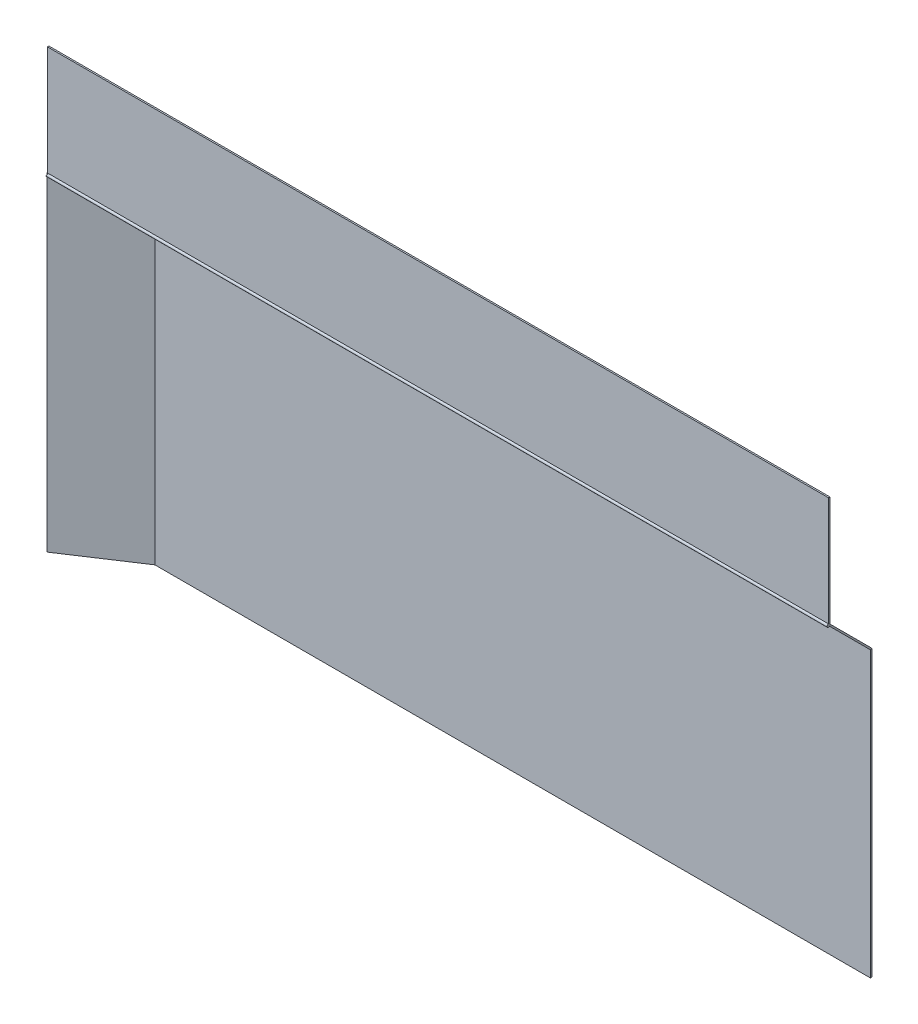
ISO-10303-21;
HEADER;
FILE_DESCRIPTION(('STEP AP214'),'2;1');
FILE_NAME('part.step','',(''),(''),'','','');
FILE_SCHEMA(('AUTOMOTIVE_DESIGN { 1 0 10303 214 1 1 1 1 }'));
ENDSEC;
DATA;
#1=APPLICATION_CONTEXT('core data for automotive mechanical design processes');
#2=APPLICATION_PROTOCOL_DEFINITION('international standard','automotive_design',2000,#1);
#3=PRODUCT_CONTEXT('',#1,'mechanical');
#4=PRODUCT('Part','Part','',(#3));
#5=PRODUCT_RELATED_PRODUCT_CATEGORY('part','',(#4));
#6=PRODUCT_DEFINITION_FORMATION('','',#4);
#7=PRODUCT_DEFINITION_CONTEXT('part definition',#1,'design');
#8=PRODUCT_DEFINITION('design','',#6,#7);
#9=PRODUCT_DEFINITION_SHAPE('','',#8);
#10=(LENGTH_UNIT() NAMED_UNIT(*) SI_UNIT(.MILLI.,.METRE.));
#11=(NAMED_UNIT(*) PLANE_ANGLE_UNIT() SI_UNIT($,.RADIAN.));
#12=(NAMED_UNIT(*) SI_UNIT($,.STERADIAN.) SOLID_ANGLE_UNIT());
#13=UNCERTAINTY_MEASURE_WITH_UNIT(LENGTH_MEASURE(1.E-05),#10,'distance_accuracy_value','');
#14=(GEOMETRIC_REPRESENTATION_CONTEXT(3) GLOBAL_UNCERTAINTY_ASSIGNED_CONTEXT((#13)) GLOBAL_UNIT_ASSIGNED_CONTEXT((#10,
#11,#12)) REPRESENTATION_CONTEXT('',''));
#15=CARTESIAN_POINT('',(0.,0.,0.));
#16=DIRECTION('',(0.,0.,1.));
#17=DIRECTION('',(1.,0.,0.));
#18=AXIS2_PLACEMENT_3D('',#15,#16,#17);
#19=CARTESIAN_POINT('',(-5357.30681818182,469.432628788306,0.565418518433503));
#20=DIRECTION('',(-0.683121837231757,-0.516403212372426,-0.516403212372414));
#21=DIRECTION('',(0.73030442659011,-0.483040083483194,-0.483040083483182));
#22=AXIS2_PLACEMENT_3D('',#19,#20,#21);
#23=PLANE('',#22);
#24=DIRECTION('',(0.73030442659011,-0.483040083483194,-0.483040083483182));
#25=VECTOR('',#24,1.);
#26=CARTESIAN_POINT('',(-5357.30681818182,463.775774538813,6.22227276792597));
#27=LINE('',#26,#25);
#28=CARTESIAN_POINT('',(-5347.89985673074,457.553794664106,0.000292893218845069));
#29=VERTEX_POINT('',#28);
#30=CARTESIAN_POINT('',(-5008.60986244772,233.139617238522,-224.41388453236));
#31=VERTEX_POINT('',#30);
#32=EDGE_CURVE('E87',#29,#31,#27,.T.);
#33=ORIENTED_EDGE('',*,*,#32,.F.);
#34=CARTESIAN_POINT('',(-5347.89985673074,463.210648913598,-5.6565613562737));
#35=CARTESIAN_POINT('',(-5347.89985673074,457.553794664106,0.000292893218812977));
#36=CARTESIAN_POINT('',(-5347.89985673074,457.497226121611,0.0568614357137381));
#37=B_SPLINE_CURVE_WITH_KNOTS('',1,(#34,#35,#36),.UNSPECIFIED.,.F.,.F.,(2,1,2),(0.,1.,1.01),.UNSPECIFIED.);
#38=CARTESIAN_POINT('',(-5347.89985673074,463.210648913598,-5.6565613562737));
#39=VERTEX_POINT('',#38);
#40=EDGE_CURVE('E181',#29,#39,#37,.F.);
#41=ORIENTED_EDGE('',*,*,#40,.T.);
#42=DIRECTION('',(0.73030442659011,-0.483040083483194,-0.483040083483182));
#43=VECTOR('',#42,1.);
#44=CARTESIAN_POINT('',(-5357.30681818182,469.432628788306,0.565418518433503));
#45=LINE('',#44,#43);
#46=CARTESIAN_POINT('',(-5008.60986244772,238.796471488014,-230.070738781852));
#47=VERTEX_POINT('',#46);
#48=EDGE_CURVE('E183',#39,#47,#45,.T.);
#49=ORIENTED_EDGE('',*,*,#48,.T.);
#50=DIRECTION('',(0.,-0.707106781186539,0.707106781186556));
#51=VECTOR('',#50,1.);
#52=CARTESIAN_POINT('',(-5008.60986244772,238.796471488014,-230.070738781852));
#53=LINE('',#52,#51);
#54=EDGE_CURVE('E198',#47,#31,#53,.T.);
#55=ORIENTED_EDGE('',*,*,#54,.T.);
#56=EDGE_LOOP('',(#33,#41,#49,#55));
#57=FACE_BOUND('',#56,.T.);
#58=ADVANCED_FACE('F61',(#57),#23,.T.);
#59=CARTESIAN_POINT('',(-5001.30681818182,228.30921640369,-229.244285367192));
#60=DIRECTION('',(0.,-0.707106781186539,0.707106781186556));
#61=DIRECTION('',(1.,0.,0.));
#62=AXIS2_PLACEMENT_3D('',#59,#60,#61);
#63=PLANE('',#62);
#64=DIRECTION('',(0.,0.707106781186556,0.707106781186539));
#65=VECTOR('',#64,1.);
#66=CARTESIAN_POINT('',(-1101.30681818182,896.525124624986,438.971622854088));
#67=LINE('',#66,#65);
#68=CARTESIAN_POINT('',(-1101.30681818182,229.197792991322,-228.35570877956));
#69=VERTEX_POINT('',#68);
#70=CARTESIAN_POINT('',(-1101.30681818182,457.55326433402,7.32233047033051E-05));
#71=VERTEX_POINT('',#70);
#72=EDGE_CURVE('E80',#69,#71,#67,.T.);
#73=ORIENTED_EDGE('',*,*,#72,.T.);
#74=CARTESIAN_POINT('',(-1101.30681818182,457.553794664106,0.000292893218789558));
#75=DIRECTION('',(-1.,0.,0.));
#76=VECTOR('',#75,1.);
#77=LINE('',#74,#76);
#78=EDGE_CURVE('E72',#71,#29,#77,.T.);
#79=ORIENTED_EDGE('',*,*,#78,.T.);
#80=ORIENTED_EDGE('',*,*,#32,.T.);
#81=CARTESIAN_POINT('',(-5001.30681818182,228.30921640369,-229.244285367192));
#82=DIRECTION('',(0.,0.707106781186539,-0.707106781186556));
#83=DIRECTION('',(1.,0.,0.));
#84=AXIS2_PLACEMENT_3D('',#81,#82,#83);
#85=CIRCLE('',#84,9.99999999999958);
#86=CARTESIAN_POINT('',(-4991.38608921184,229.197792991322,-228.35570877956));
#87=VERTEX_POINT('',#86);
#88=EDGE_CURVE('E428',#31,#87,#85,.T.);
#89=ORIENTED_EDGE('',*,*,#88,.T.);
#90=DIRECTION('',(-1.,0.,0.));
#91=VECTOR('',#90,1.);
#92=CARTESIAN_POINT('',(-5001.30681818182,229.197792991322,-228.35570877956));
#93=LINE('',#92,#91);
#94=EDGE_CURVE('E422',#69,#87,#93,.T.);
#95=ORIENTED_EDGE('',*,*,#94,.F.);
#96=EDGE_LOOP('',(#73,#79,#80,#89,#95));
#97=FACE_BOUND('',#96,.T.);
#98=ADVANCED_FACE('F487',(#97),#63,.T.);
#99=CARTESIAN_POINT('',(-1101.30681818182,902.181978874478,433.314768604595));
#100=DIRECTION('',(1.,0.,0.));
#101=DIRECTION('',(0.,0.707106781186556,0.707106781186539));
#102=AXIS2_PLACEMENT_3D('',#99,#100,#101);
#103=PLANE('',#102);
#104=DIRECTION('',(0.,0.707106781186556,0.707106781186539));
#105=VECTOR('',#104,1.);
#106=CARTESIAN_POINT('',(-1101.30681818182,469.432628788306,0.565418518433503));
#107=LINE('',#106,#105);
#108=CARTESIAN_POINT('',(-1101.30681818182,234.854647240814,-234.012563029052));
#109=VERTEX_POINT('',#108);
#110=CARTESIAN_POINT('',(-1101.30681818182,463.210648913598,-5.65656135627363));
#111=VERTEX_POINT('',#110);
#112=EDGE_CURVE('E427',#109,#111,#107,.T.);
#113=ORIENTED_EDGE('',*,*,#112,.T.);
#114=DIRECTION('',(0.,-0.707106781186544,0.707106781186551));
#115=VECTOR('',#114,1.);
#116=CARTESIAN_POINT('',(-1101.30681818182,463.210648913601,-5.65656135627662));
#117=LINE('',#116,#115);
#118=EDGE_CURVE('E12',#111,#71,#117,.T.);
#119=ORIENTED_EDGE('',*,*,#118,.T.);
#120=ORIENTED_EDGE('',*,*,#72,.F.);
#121=DIRECTION('',(0.,-0.707106781186544,0.707106781186551));
#122=VECTOR('',#121,1.);
#123=CARTESIAN_POINT('',(-1101.30681818182,234.854647240819,-234.012563029057));
#124=LINE('',#123,#122);
#125=EDGE_CURVE('E199',#109,#69,#124,.T.);
#126=ORIENTED_EDGE('',*,*,#125,.F.);
#127=EDGE_LOOP('',(#113,#119,#120,#126));
#128=FACE_BOUND('',#127,.T.);
#129=ADVANCED_FACE('F63',(#128),#103,.T.);
#130=CARTESIAN_POINT('',(-5001.30681818182,230.454430052758,-236.35570877956));
#131=DIRECTION('',(0.,0.,1.));
#132=DIRECTION('',(1.,0.,0.));
#133=AXIS2_PLACEMENT_3D('',#130,#131,#132);
#134=PLANE('',#133);
#135=DIRECTION('',(1.,0.,0.));
#136=VECTOR('',#135,1.);
#137=CARTESIAN_POINT('',(-5427.30681818182,-1319.54556994724,-236.355708779538));
#138=LINE('',#137,#136);
#139=CARTESIAN_POINT('',(-5000.37411422955,-1319.54556994724,-236.355708779538));
#140=VERTEX_POINT('',#139);
#141=CARTESIAN_POINT('',(-1101.30681818182,-1319.54556994724,-236.355708779538));
#142=VERTEX_POINT('',#141);
#143=EDGE_CURVE('E454',#140,#142,#138,.T.);
#144=ORIENTED_EDGE('',*,*,#143,.F.);
#145=DIRECTION('',(0.,1.,0.));
#146=VECTOR('',#145,1.);
#147=CARTESIAN_POINT('',(-5000.37411422955,230.454430052758,-236.35570877956));
#148=LINE('',#147,#146);
#149=CARTESIAN_POINT('',(-5000.37411422955,220.498021898337,-236.35570877956));
#150=VERTEX_POINT('',#149);
#151=EDGE_CURVE('E464',#140,#150,#148,.T.);
#152=ORIENTED_EDGE('',*,*,#151,.T.);
#153=CARTESIAN_POINT('',(-5001.30681818182,230.454430052758,-236.35570877956));
#154=DIRECTION('',(0.,0.,-1.));
#155=DIRECTION('',(1.,0.,0.));
#156=AXIS2_PLACEMENT_3D('',#153,#154,#155);
#157=CIRCLE('',#156,9.99999999999958);
#158=CARTESIAN_POINT('',(-4991.38608921184,229.197792991322,-236.35570877956));
#159=VERTEX_POINT('',#158);
#160=EDGE_CURVE('E442',#159,#150,#157,.T.);
#161=ORIENTED_EDGE('',*,*,#160,.F.);
#162=DIRECTION('',(-1.,0.,0.));
#163=VECTOR('',#162,1.);
#164=CARTESIAN_POINT('',(-5001.30681818182,229.197792991322,-236.35570877956));
#165=LINE('',#164,#163);
#166=CARTESIAN_POINT('',(-1101.30681818182,229.197792991322,-236.35570877956));
#167=VERTEX_POINT('',#166);
#168=EDGE_CURVE('E445',#167,#159,#165,.T.);
#169=ORIENTED_EDGE('',*,*,#168,.F.);
#170=DIRECTION('',(0.,1.,0.));
#171=VECTOR('',#170,1.);
#172=CARTESIAN_POINT('',(-1101.30681818182,563.454430052758,-236.355708779564));
#173=LINE('',#172,#171);
#174=EDGE_CURVE('E451',#142,#167,#173,.T.);
#175=ORIENTED_EDGE('',*,*,#174,.F.);
#176=EDGE_LOOP('',(#144,#152,#161,#169,#175));
#177=FACE_BOUND('',#176,.T.);
#178=ADVANCED_FACE('F506',(#177),#134,.F.);
#179=CARTESIAN_POINT('',(-5001.30681818182,230.454430052758,-236.35570877956));
#180=DIRECTION('',(0.,0.,1.));
#181=DIRECTION('',(1.,0.,0.));
#182=AXIS2_PLACEMENT_3D('',#179,#180,#181);
#183=CYLINDRICAL_SURFACE('',#182,9.99999999999958);
#184=DIRECTION('',(0.,0.,-1.));
#185=VECTOR('',#184,1.);
#186=CARTESIAN_POINT('',(-5000.37411422955,220.498021898337,-236.35570877956));
#187=LINE('',#186,#185);
#188=CARTESIAN_POINT('',(-5000.37411422955,220.498021898337,-228.35570877956));
#189=VERTEX_POINT('',#188);
#190=EDGE_CURVE('E461',#189,#150,#187,.T.);
#191=ORIENTED_EDGE('',*,*,#190,.F.);
#192=CARTESIAN_POINT('',(-5001.30681818182,230.454430052758,-228.35570877956));
#193=DIRECTION('',(0.,0.,-1.));
#194=DIRECTION('',(1.,0.,0.));
#195=AXIS2_PLACEMENT_3D('',#192,#193,#194);
#196=CIRCLE('',#195,9.99999999999958);
#197=EDGE_CURVE('E458',#87,#189,#196,.T.);
#198=ORIENTED_EDGE('',*,*,#197,.F.);
#199=DIRECTION('',(0.,0.,-1.));
#200=VECTOR('',#199,1.);
#201=CARTESIAN_POINT('',(-4991.38608921184,229.197792991322,-236.35570877956));
#202=LINE('',#201,#200);
#203=EDGE_CURVE('E447',#87,#159,#202,.T.);
#204=ORIENTED_EDGE('',*,*,#203,.T.);
#205=ORIENTED_EDGE('',*,*,#160,.T.);
#206=EDGE_LOOP('',(#191,#198,#204,#205));
#207=FACE_BOUND('',#206,.T.);
#208=ADVANCED_FACE('F509',(#207),#183,.F.);
#209=CARTESIAN_POINT('',(-1101.30681818182,1175.45443005276,-236.355708779573));
#210=DIRECTION('',(1.,0.,0.));
#211=DIRECTION('',(0.,1.,0.));
#212=AXIS2_PLACEMENT_3D('',#209,#210,#211);
#213=PLANE('',#212);
#214=ORIENTED_EDGE('',*,*,#174,.T.);
#215=DIRECTION('',(0.,0.,1.));
#216=VECTOR('',#215,1.);
#217=CARTESIAN_POINT('',(-1101.30681818182,229.197792991322,-236.355708779566));
#218=LINE('',#217,#216);
#219=EDGE_CURVE('E441',#167,#69,#218,.T.);
#220=ORIENTED_EDGE('',*,*,#219,.T.);
#221=DIRECTION('',(0.,1.,0.));
#222=VECTOR('',#221,1.);
#223=CARTESIAN_POINT('',(-1101.30681818182,1175.45443005276,-228.355708779573));
#224=LINE('',#223,#222);
#225=CARTESIAN_POINT('',(-1101.30681818182,-1319.54556994724,-228.355708779538));
#226=VERTEX_POINT('',#225);
#227=EDGE_CURVE('E455',#226,#69,#224,.T.);
#228=ORIENTED_EDGE('',*,*,#227,.F.);
#229=DIRECTION('',(0.,0.,1.));
#230=VECTOR('',#229,1.);
#231=CARTESIAN_POINT('',(-1101.30681818182,-1319.54556994724,-236.355708779538));
#232=LINE('',#231,#230);
#233=EDGE_CURVE('E438',#142,#226,#232,.T.);
#234=ORIENTED_EDGE('',*,*,#233,.F.);
#235=EDGE_LOOP('',(#214,#220,#228,#234));
#236=FACE_BOUND('',#235,.T.);
#237=ADVANCED_FACE('F513',(#236),#213,.T.);
#238=CARTESIAN_POINT('',(-5001.30681818182,230.454430052758,-228.35570877956));
#239=DIRECTION('',(0.,0.,1.));
#240=DIRECTION('',(1.,0.,0.));
#241=AXIS2_PLACEMENT_3D('',#238,#239,#240);
#242=PLANE('',#241);
#243=DIRECTION('',(0.,1.,0.));
#244=VECTOR('',#243,1.);
#245=CARTESIAN_POINT('',(-5000.37411422955,230.454430052758,-228.35570877956));
#246=LINE('',#245,#244);
#247=CARTESIAN_POINT('',(-5000.37411422955,-1319.54556994724,-228.355708779539));
#248=VERTEX_POINT('',#247);
#249=EDGE_CURVE('E450',#248,#189,#246,.T.);
#250=ORIENTED_EDGE('',*,*,#249,.F.);
#251=DIRECTION('',(1.,0.,0.));
#252=VECTOR('',#251,1.);
#253=CARTESIAN_POINT('',(-5427.30681818182,-1319.54556994724,-228.355708779538));
#254=LINE('',#253,#252);
#255=EDGE_CURVE('E424',#248,#226,#254,.T.);
#256=ORIENTED_EDGE('',*,*,#255,.T.);
#257=ORIENTED_EDGE('',*,*,#227,.T.);
#258=ORIENTED_EDGE('',*,*,#94,.T.);
#259=ORIENTED_EDGE('',*,*,#197,.T.);
#260=EDGE_LOOP('',(#250,#256,#257,#258,#259));
#261=FACE_BOUND('',#260,.T.);
#262=ADVANCED_FACE('F504',(#261),#242,.T.);
#263=CARTESIAN_POINT('',(-5427.30681818182,-1319.54556994724,-236.355708779538));
#264=DIRECTION('',(0.,-1.,0.));
#265=DIRECTION('',(0.,0.,-1.));
#266=AXIS2_PLACEMENT_3D('',#263,#264,#265);
#267=PLANE('',#266);
#268=DIRECTION('',(0.,0.,1.));
#269=VECTOR('',#268,1.);
#270=CARTESIAN_POINT('',(-5000.37411422955,-1319.54556994724,-236.355708779538));
#271=LINE('',#270,#269);
#272=EDGE_CURVE('E212',#140,#248,#271,.T.);
#273=ORIENTED_EDGE('',*,*,#272,.F.);
#274=ORIENTED_EDGE('',*,*,#143,.T.);
#275=ORIENTED_EDGE('',*,*,#233,.T.);
#276=ORIENTED_EDGE('',*,*,#255,.F.);
#277=EDGE_LOOP('',(#273,#274,#275,#276));
#278=FACE_BOUND('',#277,.T.);
#279=ADVANCED_FACE('F501',(#278),#267,.T.);
#280=CARTESIAN_POINT('',(-5001.30681818182,233.966070653182,-234.901139616684));
#281=DIRECTION('',(0.,-0.707106781186539,0.707106781186556));
#282=DIRECTION('',(1.,0.,0.));
#283=AXIS2_PLACEMENT_3D('',#280,#281,#282);
#284=PLANE('',#283);
#285=DIRECTION('',(-1.,0.,0.));
#286=VECTOR('',#285,1.);
#287=CARTESIAN_POINT('',(-5001.30681818182,463.210648913598,-5.65656135627363));
#288=LINE('',#287,#286);
#289=EDGE_CURVE('E189',#111,#39,#288,.T.);
#290=ORIENTED_EDGE('',*,*,#289,.F.);
#291=ORIENTED_EDGE('',*,*,#112,.F.);
#292=DIRECTION('',(-1.,0.,0.));
#293=VECTOR('',#292,1.);
#294=CARTESIAN_POINT('',(-5001.30681818182,234.854647240814,-234.012563029052));
#295=LINE('',#294,#293);
#296=CARTESIAN_POINT('',(-4991.38608921184,234.854647240814,-234.012563029052));
#297=VERTEX_POINT('',#296);
#298=EDGE_CURVE('E425',#109,#297,#295,.T.);
#299=ORIENTED_EDGE('',*,*,#298,.T.);
#300=CARTESIAN_POINT('',(-5001.30681818182,233.966070653182,-234.901139616684));
#301=DIRECTION('',(0.,0.707106781186539,-0.707106781186556));
#302=DIRECTION('',(1.,0.,0.));
#303=AXIS2_PLACEMENT_3D('',#300,#301,#302);
#304=CIRCLE('',#303,9.99999999999958);
#305=EDGE_CURVE('E197',#47,#297,#304,.T.);
#306=ORIENTED_EDGE('',*,*,#305,.F.);
#307=ORIENTED_EDGE('',*,*,#48,.F.);
#308=EDGE_LOOP('',(#290,#291,#299,#306,#307));
#309=FACE_BOUND('',#308,.T.);
#310=ADVANCED_FACE('F194',(#309),#284,.F.);
#311=CARTESIAN_POINT('',(-5001.30681818182,233.966070653182,-234.901139616684));
#312=DIRECTION('',(0.,-0.707106781186539,0.707106781186556));
#313=DIRECTION('',(1.,0.,0.));
#314=AXIS2_PLACEMENT_3D('',#311,#312,#313);
#315=CYLINDRICAL_SURFACE('',#314,9.99999999999958);
#316=DIRECTION('',(0.,0.707106781186539,-0.707106781186556));
#317=VECTOR('',#316,1.);
#318=CARTESIAN_POINT('',(-4991.38608921184,234.854647240814,-234.012563029052));
#319=LINE('',#318,#317);
#320=EDGE_CURVE('E433',#87,#297,#319,.T.);
#321=ORIENTED_EDGE('',*,*,#320,.F.);
#322=ORIENTED_EDGE('',*,*,#88,.F.);
#323=ORIENTED_EDGE('',*,*,#54,.F.);
#324=ORIENTED_EDGE('',*,*,#305,.T.);
#325=EDGE_LOOP('',(#321,#322,#323,#324));
#326=FACE_BOUND('',#325,.T.);
#327=ADVANCED_FACE('F500',(#326),#315,.F.);
#328=CARTESIAN_POINT('',(-4991.38608921184,229.197792991322,-236.35570877956));
#329=DIRECTION('',(1.,0.,0.));
#330=DIRECTION('',(0.,0.707106781186556,0.707106781186539));
#331=AXIS2_PLACEMENT_3D('',#328,#329,#330);
#332=PLANE('',#331);
#333=CARTESIAN_POINT('',(-4991.38608921184,229.197792991322,-228.35570877956));
#334=DIRECTION('',(1.,0.,0.));
#335=DIRECTION('',(0.,0.707106781186556,0.707106781186539));
#336=AXIS2_PLACEMENT_3D('',#333,#334,#335);
#337=CIRCLE('',#336,7.99999999999999);
#338=EDGE_CURVE('E419',#159,#297,#337,.T.);
#339=ORIENTED_EDGE('',*,*,#338,.F.);
#340=ORIENTED_EDGE('',*,*,#203,.F.);
#341=ORIENTED_EDGE('',*,*,#320,.T.);
#342=EDGE_LOOP('',(#339,#340,#341));
#343=FACE_BOUND('',#342,.T.);
#344=ADVANCED_FACE('F523',(#343),#332,.F.);
#345=CARTESIAN_POINT('',(-1101.30681818182,229.197792991322,-228.35570877956));
#346=DIRECTION('',(1.,0.,0.));
#347=DIRECTION('',(0.,0.707106781186556,0.707106781186539));
#348=AXIS2_PLACEMENT_3D('',#345,#346,#347);
#349=CYLINDRICAL_SURFACE('',#348,8.);
#350=CARTESIAN_POINT('',(-1101.30681818182,229.197792991322,-228.35570877956));
#351=DIRECTION('',(1.,0.,0.));
#352=DIRECTION('',(0.,0.707106781186556,0.707106781186539));
#353=AXIS2_PLACEMENT_3D('',#350,#351,#352);
#354=CIRCLE('',#353,8.);
#355=EDGE_CURVE('E416',#167,#109,#354,.T.);
#356=ORIENTED_EDGE('',*,*,#355,.F.);
#357=ORIENTED_EDGE('',*,*,#168,.T.);
#358=ORIENTED_EDGE('',*,*,#338,.T.);
#359=ORIENTED_EDGE('',*,*,#298,.F.);
#360=EDGE_LOOP('',(#356,#357,#358,#359));
#361=FACE_BOUND('',#360,.T.);
#362=ADVANCED_FACE('F527',(#361),#349,.T.);
#363=CARTESIAN_POINT('',(-1101.30681818182,229.197792991322,-236.355708779566));
#364=DIRECTION('',(-1.,0.,0.));
#365=DIRECTION('',(0.,-0.707106781186556,-0.707106781186539));
#366=AXIS2_PLACEMENT_3D('',#363,#364,#365);
#367=PLANE('',#366);
#368=ORIENTED_EDGE('',*,*,#219,.F.);
#369=ORIENTED_EDGE('',*,*,#355,.T.);
#370=ORIENTED_EDGE('',*,*,#125,.T.);
#371=EDGE_LOOP('',(#368,#369,#370));
#372=FACE_BOUND('',#371,.T.);
#373=ADVANCED_FACE('F531',(#372),#367,.F.);
#374=CARTESIAN_POINT('',(-5004.77796015023,220.498021898337,-235.034491685667));
#375=DIRECTION('',(0.,-1.,0.));
#376=DIRECTION('',(0.,0.,-1.));
#377=AXIS2_PLACEMENT_3D('',#374,#375,#376);
#378=PLANE('',#377);
#379=CARTESIAN_POINT('',(-5000.37411422955,220.498021898337,-228.35570877956));
#380=DIRECTION('',(0.,-1.,0.));
#381=DIRECTION('',(0.,0.,-1.));
#382=AXIS2_PLACEMENT_3D('',#379,#380,#381);
#383=CIRCLE('',#382,8.00000000000007);
#384=CARTESIAN_POINT('',(-5004.77796015023,220.498021898337,-235.034491685667));
#385=VERTEX_POINT('',#384);
#386=EDGE_CURVE('E413',#385,#150,#383,.T.);
#387=ORIENTED_EDGE('',*,*,#386,.F.);
#388=DIRECTION('',(-0.550480740084997,0.,-0.834847863263406));
#389=VECTOR('',#388,1.);
#390=CARTESIAN_POINT('',(-5004.77796015023,220.498021898337,-235.034491685667));
#391=LINE('',#390,#389);
#392=EDGE_CURVE('E386',#189,#385,#391,.T.);
#393=ORIENTED_EDGE('',*,*,#392,.F.);
#394=ORIENTED_EDGE('',*,*,#190,.T.);
#395=EDGE_LOOP('',(#387,#393,#394));
#396=FACE_BOUND('',#395,.T.);
#397=ADVANCED_FACE('F535',(#396),#378,.F.);
#398=CARTESIAN_POINT('',(-5000.37411422955,-1319.54556994724,-228.355708779538));
#399=DIRECTION('',(0.,-1.,0.));
#400=DIRECTION('',(0.,0.,-1.));
#401=AXIS2_PLACEMENT_3D('',#398,#399,#400);
#402=CYLINDRICAL_SURFACE('',#401,7.99999999999984);
#403=CARTESIAN_POINT('',(-5000.37411422955,-1319.54556994724,-228.355708779538));
#404=DIRECTION('',(0.,-1.,0.));
#405=DIRECTION('',(0.,0.,-1.));
#406=AXIS2_PLACEMENT_3D('',#403,#404,#405);
#407=CIRCLE('',#406,7.99999999999953);
#408=CARTESIAN_POINT('',(-5004.77796015023,-1319.54556994724,-235.034491685645));
#409=VERTEX_POINT('',#408);
#410=EDGE_CURVE('E377',#409,#140,#407,.T.);
#411=ORIENTED_EDGE('',*,*,#410,.F.);
#412=DIRECTION('',(0.,1.,0.));
#413=VECTOR('',#412,1.);
#414=CARTESIAN_POINT('',(-5004.77796015023,230.454430052758,-235.034491685667));
#415=LINE('',#414,#413);
#416=EDGE_CURVE('E297',#409,#385,#415,.T.);
#417=ORIENTED_EDGE('',*,*,#416,.T.);
#418=ORIENTED_EDGE('',*,*,#386,.T.);
#419=ORIENTED_EDGE('',*,*,#151,.F.);
#420=EDGE_LOOP('',(#411,#417,#418,#419));
#421=FACE_BOUND('',#420,.T.);
#422=ADVANCED_FACE('F539',(#421),#402,.T.);
#423=CARTESIAN_POINT('',(-5004.77796015023,-1319.54556994724,-235.034491685645));
#424=DIRECTION('',(0.,1.,0.));
#425=DIRECTION('',(0.,0.,1.));
#426=AXIS2_PLACEMENT_3D('',#423,#424,#425);
#427=PLANE('',#426);
#428=DIRECTION('',(0.550480740084997,0.,0.834847863263406));
#429=VECTOR('',#428,1.);
#430=CARTESIAN_POINT('',(-5004.77796015023,-1319.54556994724,-235.034491685646));
#431=LINE('',#430,#429);
#432=EDGE_CURVE('E369',#409,#248,#431,.T.);
#433=ORIENTED_EDGE('',*,*,#432,.F.);
#434=ORIENTED_EDGE('',*,*,#410,.T.);
#435=ORIENTED_EDGE('',*,*,#272,.T.);
#436=EDGE_LOOP('',(#433,#434,#435));
#437=FACE_BOUND('',#436,.T.);
#438=ADVANCED_FACE('F543',(#437),#427,.F.);
#439=CARTESIAN_POINT('',(-5359.64448399884,466.454430052761,-1.04313197138495));
#440=DIRECTION('',(-0.834847863263406,0.,0.550480740084997));
#441=DIRECTION('',(0.,-1.,0.));
#442=AXIS2_PLACEMENT_3D('',#439,#440,#441);
#443=PLANE('',#442);
#444=DIRECTION('',(0.,-1.,0.));
#445=VECTOR('',#444,1.);
#446=CARTESIAN_POINT('',(-5355.24063807816,466.454430052761,5.63565093472246));
#447=LINE('',#446,#445);
#448=CARTESIAN_POINT('',(-5355.24063807816,466.454430052761,5.63565093472246));
#449=VERTEX_POINT('',#448);
#450=CARTESIAN_POINT('',(-5355.24063807816,-1319.54556994724,5.63565093474677));
#451=VERTEX_POINT('',#450);
#452=EDGE_CURVE('E389',#449,#451,#447,.T.);
#453=ORIENTED_EDGE('',*,*,#452,.F.);
#454=DIRECTION('',(0.550480740084997,0.,0.834847863263406));
#455=VECTOR('',#454,1.);
#456=CARTESIAN_POINT('',(-5359.64448399884,466.454430052761,-1.04313197138495));
#457=LINE('',#456,#455);
#458=CARTESIAN_POINT('',(-5359.64448399884,466.454430052761,-1.04313197138495));
#459=VERTEX_POINT('',#458);
#460=EDGE_CURVE('E399',#459,#449,#457,.T.);
#461=ORIENTED_EDGE('',*,*,#460,.F.);
#462=DIRECTION('',(0.,-1.,0.));
#463=VECTOR('',#462,1.);
#464=CARTESIAN_POINT('',(-5359.64448399884,466.454430052761,-1.04313197138495));
#465=LINE('',#464,#463);
#466=CARTESIAN_POINT('',(-5359.64448399884,-1319.54556994724,-1.04313197136047));
#467=VERTEX_POINT('',#466);
#468=EDGE_CURVE('E407',#459,#467,#465,.T.);
#469=ORIENTED_EDGE('',*,*,#468,.T.);
#470=DIRECTION('',(0.550480740084997,0.,0.834847863263406));
#471=VECTOR('',#470,1.);
#472=CARTESIAN_POINT('',(-5359.64448399884,-1319.54556994724,-1.04313197136047));
#473=LINE('',#472,#471);
#474=EDGE_CURVE('E405',#467,#451,#473,.T.);
#475=ORIENTED_EDGE('',*,*,#474,.T.);
#476=EDGE_LOOP('',(#453,#461,#469,#475));
#477=FACE_BOUND('',#476,.T.);
#478=ADVANCED_FACE('F547',(#477),#443,.T.);
#479=CARTESIAN_POINT('',(-5011.30202403213,235.300395297267,-230.732664164627));
#480=DIRECTION('',(0.404564372982764,0.874737794136069,-0.266761053422398));
#481=DIRECTION('',(-0.730272978350245,0.484596524450975,0.481526308296336));
#482=AXIS2_PLACEMENT_3D('',#479,#480,#481);
#483=PLANE('',#482);
#484=ORIENTED_EDGE('',*,*,#460,.T.);
#485=DIRECTION('',(-0.730272978350245,0.484596524450975,0.481526308296336));
#486=VECTOR('',#485,1.);
#487=CARTESIAN_POINT('',(-5006.89817811145,235.300395297267,-224.05388125852));
#488=LINE('',#487,#486);
#489=CARTESIAN_POINT('',(-5006.89817811145,235.300395297267,-224.05388125852));
#490=VERTEX_POINT('',#489);
#491=EDGE_CURVE('E392',#490,#449,#488,.T.);
#492=ORIENTED_EDGE('',*,*,#491,.F.);
#493=DIRECTION('',(0.550480740084997,0.,0.834847863263406));
#494=VECTOR('',#493,1.);
#495=CARTESIAN_POINT('',(-5011.30202403213,235.300395297267,-230.732664164627));
#496=LINE('',#495,#494);
#497=CARTESIAN_POINT('',(-5011.30202403213,235.300395297267,-230.732664164627));
#498=VERTEX_POINT('',#497);
#499=EDGE_CURVE('E381',#498,#490,#496,.T.);
#500=ORIENTED_EDGE('',*,*,#499,.F.);
#501=DIRECTION('',(-0.730272978350245,0.484596524450975,0.481526308296336));
#502=VECTOR('',#501,1.);
#503=CARTESIAN_POINT('',(-5011.30202403213,235.300395297267,-230.732664164627));
#504=LINE('',#503,#502);
#505=EDGE_CURVE('E402',#498,#459,#504,.T.);
#506=ORIENTED_EDGE('',*,*,#505,.T.);
#507=EDGE_LOOP('',(#484,#492,#500,#506));
#508=FACE_BOUND('',#507,.T.);
#509=ADVANCED_FACE('F565',(#508),#483,.T.);
#510=CARTESIAN_POINT('',(-4999.59544832794,230.454430052758,-228.869144341483));
#511=DIRECTION('',(0.550480740084997,0.,0.834847863263406));
#512=DIRECTION('',(0.834847863263406,0.,-0.550480740084997));
#513=AXIS2_PLACEMENT_3D('',#510,#511,#512);
#514=PLANE('',#513);
#515=DIRECTION('',(0.834847863263406,0.,-0.550480740084997));
#516=VECTOR('',#515,1.);
#517=CARTESIAN_POINT('',(-5355.24063807816,-1319.54556994724,5.63565093474677));
#518=LINE('',#517,#516);
#519=EDGE_CURVE('E396',#451,#248,#518,.T.);
#520=ORIENTED_EDGE('',*,*,#519,.T.);
#521=ORIENTED_EDGE('',*,*,#249,.T.);
#522=CARTESIAN_POINT('',(-4999.59544832794,230.454430052758,-228.869144341483));
#523=DIRECTION('',(-0.550480740084997,0.,-0.834847863263406));
#524=DIRECTION('',(0.834847863263406,0.,-0.550480740084997));
#525=AXIS2_PLACEMENT_3D('',#522,#523,#524);
#526=CIRCLE('',#525,9.99999999999958);
#527=EDGE_CURVE('E394',#189,#490,#526,.T.);
#528=ORIENTED_EDGE('',*,*,#527,.T.);
#529=ORIENTED_EDGE('',*,*,#491,.T.);
#530=ORIENTED_EDGE('',*,*,#452,.T.);
#531=EDGE_LOOP('',(#520,#521,#528,#529,#530));
#532=FACE_BOUND('',#531,.T.);
#533=ADVANCED_FACE('F561',(#532),#514,.T.);
#534=CARTESIAN_POINT('',(-5003.99929424863,230.454430052758,-235.54792724759));
#535=DIRECTION('',(0.550480740084997,0.,0.834847863263406));
#536=DIRECTION('',(0.834847863263406,0.,-0.550480740084997));
#537=AXIS2_PLACEMENT_3D('',#534,#535,#536);
#538=CYLINDRICAL_SURFACE('',#537,9.99999999999958);
#539=ORIENTED_EDGE('',*,*,#527,.F.);
#540=ORIENTED_EDGE('',*,*,#392,.T.);
#541=CARTESIAN_POINT('',(-5003.99929424863,230.454430052758,-235.54792724759));
#542=DIRECTION('',(-0.550480740084997,0.,-0.834847863263406));
#543=DIRECTION('',(0.834847863263406,0.,-0.550480740084997));
#544=AXIS2_PLACEMENT_3D('',#541,#542,#543);
#545=CIRCLE('',#544,9.99999999999958);
#546=EDGE_CURVE('E384',#385,#498,#545,.T.);
#547=ORIENTED_EDGE('',*,*,#546,.T.);
#548=ORIENTED_EDGE('',*,*,#499,.T.);
#549=EDGE_LOOP('',(#539,#540,#547,#548));
#550=FACE_BOUND('',#549,.T.);
#551=ADVANCED_FACE('F557',(#550),#538,.F.);
#552=CARTESIAN_POINT('',(-5003.99929424863,230.454430052758,-235.54792724759));
#553=DIRECTION('',(0.550480740084997,0.,0.834847863263406));
#554=DIRECTION('',(0.834847863263406,0.,-0.550480740084997));
#555=AXIS2_PLACEMENT_3D('',#552,#553,#554);
#556=PLANE('',#555);
#557=ORIENTED_EDGE('',*,*,#416,.F.);
#558=DIRECTION('',(0.834847863263406,0.,-0.550480740084997));
#559=VECTOR('',#558,1.);
#560=CARTESIAN_POINT('',(-5359.64448399884,-1319.54556994724,-1.04313197136047));
#561=LINE('',#560,#559);
#562=EDGE_CURVE('E378',#467,#409,#561,.T.);
#563=ORIENTED_EDGE('',*,*,#562,.F.);
#564=ORIENTED_EDGE('',*,*,#468,.F.);
#565=ORIENTED_EDGE('',*,*,#505,.F.);
#566=ORIENTED_EDGE('',*,*,#546,.F.);
#567=EDGE_LOOP('',(#557,#563,#564,#565,#566));
#568=FACE_BOUND('',#567,.T.);
#569=ADVANCED_FACE('F553',(#568),#556,.F.);
#570=CARTESIAN_POINT('',(-5359.64448399884,-1319.54556994724,-1.04313197136047));
#571=DIRECTION('',(0.,-1.,0.));
#572=DIRECTION('',(-0.550480740084997,0.,-0.834847863263406));
#573=AXIS2_PLACEMENT_3D('',#570,#571,#572);
#574=PLANE('',#573);
#575=ORIENTED_EDGE('',*,*,#562,.T.);
#576=ORIENTED_EDGE('',*,*,#432,.T.);
#577=ORIENTED_EDGE('',*,*,#519,.F.);
#578=ORIENTED_EDGE('',*,*,#474,.F.);
#579=EDGE_LOOP('',(#575,#576,#577,#578));
#580=FACE_BOUND('',#579,.T.);
#581=ADVANCED_FACE('F549',(#580),#574,.T.);
#582=CARTESIAN_POINT('',(-5357.30681818182,1060.7538792337,-8.));
#583=DIRECTION('',(0.,1.,0.));
#584=DIRECTION('',(0.,0.,1.));
#585=AXIS2_PLACEMENT_3D('',#582,#583,#584);
#586=PLANE('',#585);
#587=DIRECTION('',(-1.,0.,0.));
#588=VECTOR('',#587,1.);
#589=CARTESIAN_POINT('',(-5357.30681818182,1060.7538792337,0.));
#590=LINE('',#589,#588);
#591=CARTESIAN_POINT('',(-1101.30681818182,1060.7538792337,0.));
#592=VERTEX_POINT('',#591);
#593=CARTESIAN_POINT('',(-5357.30681818182,1060.7538792337,0.));
#594=VERTEX_POINT('',#593);
#595=EDGE_CURVE('E301',#592,#594,#590,.T.);
#596=ORIENTED_EDGE('',*,*,#595,.F.);
#597=DIRECTION('',(0.,0.,1.));
#598=VECTOR('',#597,1.);
#599=CARTESIAN_POINT('',(-1101.30681818182,1060.7538792337,-8.));
#600=LINE('',#599,#598);
#601=CARTESIAN_POINT('',(-1101.30681818182,1060.7538792337,-8.));
#602=VERTEX_POINT('',#601);
#603=EDGE_CURVE('E289',#602,#592,#600,.T.);
#604=ORIENTED_EDGE('',*,*,#603,.F.);
#605=DIRECTION('',(-1.,0.,0.));
#606=VECTOR('',#605,1.);
#607=CARTESIAN_POINT('',(-5357.30681818182,1060.7538792337,-8.));
#608=LINE('',#607,#606);
#609=CARTESIAN_POINT('',(-5357.30681818182,1060.7538792337,-8.));
#610=VERTEX_POINT('',#609);
#611=EDGE_CURVE('E308',#602,#610,#608,.T.);
#612=ORIENTED_EDGE('',*,*,#611,.T.);
#613=DIRECTION('',(0.,0.,1.));
#614=VECTOR('',#613,1.);
#615=CARTESIAN_POINT('',(-5357.30681818182,1060.7538792337,-8.));
#616=LINE('',#615,#614);
#617=EDGE_CURVE('E305',#610,#594,#616,.T.);
#618=ORIENTED_EDGE('',*,*,#617,.T.);
#619=EDGE_LOOP('',(#596,#604,#612,#618));
#620=FACE_BOUND('',#619,.T.);
#621=ADVANCED_FACE('F552',(#620),#586,.T.);
#622=CARTESIAN_POINT('',(-5001.30681818182,115.753879233701,-8.));
#623=DIRECTION('',(0.,0.,1.));
#624=DIRECTION('',(1.,0.,0.));
#625=AXIS2_PLACEMENT_3D('',#622,#623,#624);
#626=PLANE('',#625);
#627=DIRECTION('',(0.,1.,0.));
#628=VECTOR('',#627,1.);
#629=CARTESIAN_POINT('',(-1101.30681818182,448.753879233702,-8.));
#630=LINE('',#629,#628);
#631=CARTESIAN_POINT('',(-1101.30681818182,457.553087557325,-8.));
#632=VERTEX_POINT('',#631);
#633=EDGE_CURVE('E298',#632,#602,#630,.T.);
#634=ORIENTED_EDGE('',*,*,#633,.F.);
#635=DIRECTION('',(-1.,0.,0.));
#636=VECTOR('',#635,1.);
#637=CARTESIAN_POINT('',(-5001.30681818182,457.553087557325,-8.));
#638=LINE('',#637,#636);
#639=CARTESIAN_POINT('',(-5357.30681818182,457.553087557325,-8.));
#640=VERTEX_POINT('',#639);
#641=EDGE_CURVE('E307',#632,#640,#638,.T.);
#642=ORIENTED_EDGE('',*,*,#641,.T.);
#643=DIRECTION('',(0.,-1.,0.));
#644=VECTOR('',#643,1.);
#645=CARTESIAN_POINT('',(-5357.30681818182,448.753879233702,-8.));
#646=LINE('',#645,#644);
#647=EDGE_CURVE('E353',#610,#640,#646,.T.);
#648=ORIENTED_EDGE('',*,*,#647,.F.);
#649=ORIENTED_EDGE('',*,*,#611,.F.);
#650=EDGE_LOOP('',(#634,#642,#648,#649));
#651=FACE_BOUND('',#650,.T.);
#652=ADVANCED_FACE('F613',(#651),#626,.F.);
#653=CARTESIAN_POINT('',(-5357.30681818182,448.753879233702,-8.));
#654=DIRECTION('',(-1.,0.,0.));
#655=DIRECTION('',(0.,-1.,0.));
#656=AXIS2_PLACEMENT_3D('',#653,#654,#655);
#657=PLANE('',#656);
#658=CARTESIAN_POINT('',(-5357.30681818182,457.553087557325,0.00096254331964677));
#659=DIRECTION('',(0.,0.,-1.));
#660=VECTOR('',#659,1.);
#661=LINE('',#658,#660);
#662=CARTESIAN_POINT('',(-5357.30681818182,457.552895965609,0.00096254331964677));
#663=VERTEX_POINT('',#662);
#664=EDGE_CURVE('E285',#663,#640,#661,.T.);
#665=ORIENTED_EDGE('',*,*,#664,.F.);
#666=DIRECTION('',(0.,-1.,0.));
#667=VECTOR('',#666,1.);
#668=CARTESIAN_POINT('',(-5357.30681818182,448.753879233702,0.));
#669=LINE('',#668,#667);
#670=EDGE_CURVE('E300',#594,#663,#669,.T.);
#671=ORIENTED_EDGE('',*,*,#670,.F.);
#672=ORIENTED_EDGE('',*,*,#617,.F.);
#673=ORIENTED_EDGE('',*,*,#647,.T.);
#674=EDGE_LOOP('',(#665,#671,#672,#673));
#675=FACE_BOUND('',#674,.T.);
#676=ADVANCED_FACE('F332',(#675),#657,.T.);
#677=CARTESIAN_POINT('',(-5001.30681818182,115.753879233701,0.));
#678=DIRECTION('',(0.,0.,1.));
#679=DIRECTION('',(1.,0.,0.));
#680=AXIS2_PLACEMENT_3D('',#677,#678,#679);
#681=PLANE('',#680);
#682=CARTESIAN_POINT('',(-5347.89985673074,457.553794664106,0.000292893218812977));
#683=CARTESIAN_POINT('',(-5348.29181345787,457.55387565416,0.000373883272373124));
#684=CARTESIAN_POINT('',(-5348.68377018499,457.553942575641,0.000468904475037108));
#685=CARTESIAN_POINT('',(-5349.46768363925,457.554040517595,0.000675985338112068));
#686=CARTESIAN_POINT('',(-5349.85964036638,457.55407151544,0.00078799715559113));
#687=CARTESIAN_POINT('',(-5350.64355382064,457.554093968663,0.00101596856375243));
#688=CARTESIAN_POINT('',(-5351.03551054777,457.554085418855,0.00113187548504852));
#689=CARTESIAN_POINT('',(-5351.81942400202,457.554029758301,0.00135408487474792));
#690=CARTESIAN_POINT('',(-5352.21138072915,457.553982660414,0.00146033600500926));
#691=CARTESIAN_POINT('',(-5352.99529418341,457.55385539346,0.00165080446105148));
#692=CARTESIAN_POINT('',(-5353.38725091054,457.553775253797,0.00173497778194516));
#693=CARTESIAN_POINT('',(-5354.17116436479,457.553591259462,0.00187143728101949));
#694=CARTESIAN_POINT('',(-5354.56312109192,457.5534874473,0.00192369193225855));
#695=CARTESIAN_POINT('',(-5355.34703454618,457.553268236705,0.00199018873920204));
#696=CARTESIAN_POINT('',(-5355.73899127331,457.553152888918,0.0020044155318093));
#697=CARTESIAN_POINT('',(-5356.52290472756,457.552924090383,0.00199317538059516));
#698=CARTESIAN_POINT('',(-5356.91486145469,457.552810692497,0.00196771103364548));
#699=CARTESIAN_POINT('',(-5357.30681818182,457.552704873892,0.00192387953250762));
#700=B_SPLINE_CURVE_WITH_KNOTS('',3,(#682,#683,#684,#685,#686,#687,#688,#689,#690,#691,#692,
#693,#694,#695,#696,#697,#698,#699),.UNSPECIFIED.,.F.,.F.,(4,2,2,2,2,2,2,2,4),(0.,0.125,0.25,
0.375,0.5,0.625,0.75,0.875,1.),.UNSPECIFIED.);
#701=EDGE_CURVE('E315',#29,#663,#700,.T.);
#702=ORIENTED_EDGE('',*,*,#701,.F.);
#703=ORIENTED_EDGE('',*,*,#78,.F.);
#704=DIRECTION('',(0.,1.,0.));
#705=VECTOR('',#704,1.);
#706=CARTESIAN_POINT('',(-1101.30681818182,1060.7538792337,0.));
#707=LINE('',#706,#705);
#708=EDGE_CURVE('E304',#71,#592,#707,.T.);
#709=ORIENTED_EDGE('',*,*,#708,.T.);
#710=ORIENTED_EDGE('',*,*,#595,.T.);
#711=ORIENTED_EDGE('',*,*,#670,.T.);
#712=EDGE_LOOP('',(#702,#703,#709,#710,#711));
#713=FACE_BOUND('',#712,.T.);
#714=ADVANCED_FACE('F321',(#713),#681,.T.);
#715=CARTESIAN_POINT('',(-1101.30681818182,1060.7538792337,-8.));
#716=DIRECTION('',(1.,0.,0.));
#717=DIRECTION('',(0.,1.,0.));
#718=AXIS2_PLACEMENT_3D('',#715,#716,#717);
#719=PLANE('',#718);
#720=DIRECTION('',(0.,0.,1.));
#721=VECTOR('',#720,1.);
#722=CARTESIAN_POINT('',(-1101.30681818182,457.553087557325,-8.00000000000421));
#723=LINE('',#722,#721);
#724=EDGE_CURVE('E342',#632,#71,#723,.T.);
#725=ORIENTED_EDGE('',*,*,#724,.F.);
#726=ORIENTED_EDGE('',*,*,#633,.T.);
#727=ORIENTED_EDGE('',*,*,#603,.T.);
#728=ORIENTED_EDGE('',*,*,#708,.F.);
#729=EDGE_LOOP('',(#725,#726,#727,#728));
#730=FACE_BOUND('',#729,.T.);
#731=ADVANCED_FACE('F331',(#730),#719,.T.);
#732=CARTESIAN_POINT('',(-1101.30681818182,457.553087557325,0.000999999999999265));
#733=DIRECTION('',(1.,0.,0.));
#734=DIRECTION('',(0.,0.,-1.));
#735=AXIS2_PLACEMENT_3D('',#732,#733,#734);
#736=PLANE('',#735);
#737=ORIENTED_EDGE('',*,*,#724,.T.);
#738=ORIENTED_EDGE('',*,*,#118,.F.);
#739=CARTESIAN_POINT('',(-1101.30681818182,457.553087557325,0.000999999999999265));
#740=DIRECTION('',(-1.,0.,0.));
#741=DIRECTION('',(0.,0.,-1.));
#742=AXIS2_PLACEMENT_3D('',#739,#740,#741);
#743=CIRCLE('',#742,8.001);
#744=EDGE_CURVE('E211',#632,#111,#743,.T.);
#745=ORIENTED_EDGE('',*,*,#744,.F.);
#746=EDGE_LOOP('',(#737,#738,#745));
#747=FACE_BOUND('',#746,.T.);
#748=ADVANCED_FACE('F241',(#747),#736,.T.);
#749=CARTESIAN_POINT('',(-5347.89985673074,463.210648913598,-5.6565613562737));
#750=CARTESIAN_POINT('',(-5348.2918485494,463.858708347116,-5.00850192275642));
#751=CARTESIAN_POINT('',(-5348.68377018499,464.394089104642,-4.24829529527585));
#752=CARTESIAN_POINT('',(-5349.46768363925,465.177722678569,-2.59144130979586));
#753=CARTESIAN_POINT('',(-5349.85964036638,465.425736433155,-1.69523475814553));
#754=CARTESIAN_POINT('',(-5350.64355382064,465.605384677703,0.128764478591546));
#755=CARTESIAN_POINT('',(-5351.03551054777,465.536977662623,1.05613575589768));
#756=CARTESIAN_POINT('',(-5351.81942400202,465.091637565646,2.83403308291401));
#757=CARTESIAN_POINT('',(-5352.21138072915,464.714807372928,3.68414837600125));
#758=CARTESIAN_POINT('',(-5352.99529418341,463.696544477787,5.20808649277813));
#759=CARTESIAN_POINT('',(-5353.38725091054,463.055347029797,5.88155723332724));
#760=CARTESIAN_POINT('',(-5354.17116436479,461.583208355341,6.97336968542584));
#761=CARTESIAN_POINT('',(-5354.56312109192,460.752607244528,7.39145915001544));
#762=CARTESIAN_POINT('',(-5355.34703454618,458.998703275548,7.92350010237127));
#763=CARTESIAN_POINT('',(-5355.73899127331,458.075805630697,8.03732867002194));
#764=CARTESIAN_POINT('',(-5356.52290472756,456.245188559366,7.94739622017324));
#765=CARTESIAN_POINT('',(-5356.91482636316,455.337967869845,7.7436873777057));
#766=CARTESIAN_POINT('',(-5357.30681818182,454.491237414972,7.39296013962286));
#767=CARTESIAN_POINT('',(-5347.89985673074,457.553794664106,0.000292893218812977));
#768=CARTESIAN_POINT('',(-5348.29181345787,457.55387565416,0.000373883272373124));
#769=CARTESIAN_POINT('',(-5348.68377018499,457.553942575641,0.000468904475037108));
#770=CARTESIAN_POINT('',(-5349.46768363925,457.554040517595,0.000675985338112068));
#771=CARTESIAN_POINT('',(-5349.85964036638,457.55407151544,0.00078799715559113));
#772=CARTESIAN_POINT('',(-5350.64355382064,457.554093968663,0.00101596856375243));
#773=CARTESIAN_POINT('',(-5351.03551054777,457.554085418855,0.00113187548504852));
#774=CARTESIAN_POINT('',(-5351.81942400202,457.554029758301,0.00135408487474792));
#775=CARTESIAN_POINT('',(-5352.21138072915,457.553982660414,0.00146033600500926));
#776=CARTESIAN_POINT('',(-5352.99529418341,457.55385539346,0.00165080446105148));
#777=CARTESIAN_POINT('',(-5353.38725091054,457.553775253797,0.00173497778194516));
#778=CARTESIAN_POINT('',(-5354.17116436479,457.553591259462,0.00187143728101949));
#779=CARTESIAN_POINT('',(-5354.56312109192,457.5534874473,0.00192369193225855));
#780=CARTESIAN_POINT('',(-5355.34703454618,457.553268236705,0.00199018873920204));
#781=CARTESIAN_POINT('',(-5355.73899127331,457.553152888918,0.0020044155318093));
#782=CARTESIAN_POINT('',(-5356.52290472756,457.552924090383,0.00199317538059516));
#783=CARTESIAN_POINT('',(-5356.91486145469,457.552810692497,0.00196771103364548));
#784=CARTESIAN_POINT('',(-5357.30681818182,457.552704873892,0.00192387953250762));
#785=CARTESIAN_POINT('',(-5347.89985673074,457.497226121611,0.0568614357137381));
#786=CARTESIAN_POINT('',(-5348.29181310695,457.49082732723,0.0504626413326611));
#787=CARTESIAN_POINT('',(-5348.68377018499,457.485541110351,0.0429565464725459));
#788=CARTESIAN_POINT('',(-5349.46768363925,457.477803695985,0.0265971582894518));
#789=CARTESIAN_POINT('',(-5349.85964036638,457.475354866262,0.0177482247086024));
#790=CARTESIAN_POINT('',(-5350.64355382064,457.473581061573,-0.00026151653652551));
#791=CARTESIAN_POINT('',(-5351.03551054777,457.474256496418,-0.00941816331907778));
#792=CARTESIAN_POINT('',(-5351.81942400202,457.478653680227,-0.0269727051056447));
#793=CARTESIAN_POINT('',(-5352.21138072915,457.482374413289,-0.0353665443949532));
#794=CARTESIAN_POINT('',(-5352.99529418341,457.492428502617,-0.0504135524221194));
#795=CARTESIAN_POINT('',(-5353.38725091054,457.498759536037,-0.0570632447735078));
#796=CARTESIAN_POINT('',(-5354.17116436479,457.513295088503,-0.0678435452004287));
#797=CARTESIAN_POINT('',(-5354.56312109192,457.521496249327,-0.0719716626485733));
#798=CARTESIAN_POINT('',(-5355.34703454618,457.538813886316,-0.0772249103971186));
#799=CARTESIAN_POINT('',(-5355.73899127331,457.5479263615,-0.078348827013092));
#800=CARTESIAN_POINT('',(-5356.52290472756,457.566001445694,-0.0774608550673313));
#801=CARTESIAN_POINT('',(-5356.91486180561,457.574959120723,-0.0754494856330751));
#802=CARTESIAN_POINT('',(-5357.30681818182,457.583319548482,-0.0719864830683959));
#803=B_SPLINE_SURFACE_WITH_KNOTS('',1,3,((#749,#750,#751,#752,#753,#754,#755,#756,#757,#758,
#759,#760,#761,#762,#763,#764,#765,#766),(#767,#768,#769,#770,#771,#772,#773,#774,#775,#776,
#777,#778,#779,#780,#781,#782,#783,#784),(#785,#786,#787,#788,#789,#790,#791,#792,#793,#794,
#795,#796,#797,#798,#799,#800,#801,#802)),.UNSPECIFIED.,.F.,.F.,.F.,(2,1,2),(4,2,2,2,2,2,2,2,4),
(0.,1.,1.01),(0.,0.125,0.25,0.375,0.5,0.625,0.75,0.875,1.),.UNSPECIFIED.);
#804=CARTESIAN_POINT('',(-5357.30681818182,457.583319548482,-0.0719864830683959));
#805=CARTESIAN_POINT('',(-5357.30681818182,457.552704873892,0.00192387953250762));
#806=CARTESIAN_POINT('',(-5357.30681818182,454.491237414972,7.39296013962286));
#807=B_SPLINE_CURVE_WITH_KNOTS('',1,(#804,#805,#806),.UNSPECIFIED.,.F.,.F.,(2,1,2),(0.,0.01,
1.01),.UNSPECIFIED.);
#808=CARTESIAN_POINT('',(-5357.30681818182,454.491237414972,7.39296013962286));
#809=VERTEX_POINT('',#808);
#810=EDGE_CURVE('E217',#663,#809,#807,.T.);
#811=CARTESIAN_POINT('',(-5357.30681818182,454.491237414972,7.39296013962286));
#812=CARTESIAN_POINT('',(-5356.91482636316,455.337967869845,7.7436873777057));
#813=CARTESIAN_POINT('',(-5356.52290472756,456.245188559366,7.94739622017324));
#814=CARTESIAN_POINT('',(-5355.73899127331,458.075805630697,8.03732867002194));
#815=CARTESIAN_POINT('',(-5355.34703454618,458.998703275548,7.92350010237127));
#816=CARTESIAN_POINT('',(-5354.56312109192,460.752607244528,7.39145915001544));
#817=CARTESIAN_POINT('',(-5354.17116436479,461.583208355341,6.97336968542584));
#818=CARTESIAN_POINT('',(-5353.38725091054,463.055347029797,5.88155723332724));
#819=CARTESIAN_POINT('',(-5352.99529418341,463.696544477787,5.20808649277813));
#820=CARTESIAN_POINT('',(-5352.21138072915,464.714807372928,3.68414837600125));
#821=CARTESIAN_POINT('',(-5351.81942400202,465.091637565646,2.83403308291401));
#822=CARTESIAN_POINT('',(-5351.03551054777,465.536977662623,1.05613575589768));
#823=CARTESIAN_POINT('',(-5350.64355382064,465.605384677703,0.128764478591546));
#824=CARTESIAN_POINT('',(-5349.85964036638,465.425736433155,-1.69523475814553));
#825=CARTESIAN_POINT('',(-5349.46768363925,465.177722678569,-2.59144130979586));
#826=CARTESIAN_POINT('',(-5348.68377018499,464.394089104642,-4.24829529527585));
#827=CARTESIAN_POINT('',(-5348.2918485494,463.858708347116,-5.00850192275642));
#828=CARTESIAN_POINT('',(-5347.89985673074,463.210648913598,-5.6565613562737));
#829=B_SPLINE_CURVE_WITH_KNOTS('',3,(#811,#812,#813,#814,#815,#816,#817,#818,#819,#820,#821,
#822,#823,#824,#825,#826,#827,#828),.UNSPECIFIED.,.F.,.F.,(4,2,2,2,2,2,2,2,4),(0.,0.125,0.25,
0.375,0.5,0.625,0.75,0.875,1.),.UNSPECIFIED.);
#830=EDGE_CURVE('E206',#39,#809,#829,.F.);
#831=ORIENTED_EDGE('',*,*,#40,.F.);
#832=ORIENTED_EDGE('',*,*,#701,.T.);
#833=ORIENTED_EDGE('',*,*,#810,.T.);
#834=ORIENTED_EDGE('',*,*,#830,.F.);
#835=EDGE_LOOP('',(#831,#832,#833,#834));
#836=FACE_BOUND('',#835,.T.);
#837=ADVANCED_FACE('F215',(#836),#803,.T.);
#838=CARTESIAN_POINT('',(-5357.30681818182,457.553087557325,0.000999999999999265));
#839=DIRECTION('',(-1.,0.,0.));
#840=DIRECTION('',(0.,0.,1.));
#841=AXIS2_PLACEMENT_3D('',#838,#839,#840);
#842=PLANE('',#841);
#843=ORIENTED_EDGE('',*,*,#810,.F.);
#844=ORIENTED_EDGE('',*,*,#664,.T.);
#845=CARTESIAN_POINT('',(-5357.30681818182,457.553087557325,0.000999999999999265));
#846=DIRECTION('',(1.,0.,0.));
#847=DIRECTION('',(0.,0.,1.));
#848=AXIS2_PLACEMENT_3D('',#845,#846,#847);
#849=CIRCLE('',#848,8.001);
#850=EDGE_CURVE('E220',#809,#640,#849,.T.);
#851=ORIENTED_EDGE('',*,*,#850,.F.);
#852=EDGE_LOOP('',(#843,#844,#851));
#853=FACE_BOUND('',#852,.T.);
#854=ADVANCED_FACE('F240',(#853),#842,.T.);
#855=CARTESIAN_POINT('',(1026.73708481877,457.553087557325,0.000999999999999265));
#856=DIRECTION('',(-1.,0.,0.));
#857=DIRECTION('',(0.,0.,1.));
#858=AXIS2_PLACEMENT_3D('',#855,#856,#857);
#859=CYLINDRICAL_SURFACE('',#858,8.001);
#860=ORIENTED_EDGE('',*,*,#850,.T.);
#861=ORIENTED_EDGE('',*,*,#641,.F.);
#862=ORIENTED_EDGE('',*,*,#744,.T.);
#863=ORIENTED_EDGE('',*,*,#289,.T.);
#864=ORIENTED_EDGE('',*,*,#830,.T.);
#865=EDGE_LOOP('',(#860,#861,#862,#863,#864));
#866=FACE_BOUND('',#865,.T.);
#867=ADVANCED_FACE('F205',(#866),#859,.T.);
#868=CLOSED_SHELL('',(#58,#98,#129,#178,#208,#237,#262,#279,#310,#327,#344,#362,#373,#397,#422,
#438,#478,#509,#533,#551,#569,#581,#621,#652,#676,#714,#731,#748,#837,#854,#867));
#869=MANIFOLD_SOLID_BREP('B2',#868);
#870=ADVANCED_BREP_SHAPE_REPRESENTATION('',(#18,#869),#14);
#871=SHAPE_DEFINITION_REPRESENTATION(#9,#870);
ENDSEC;
END-ISO-10303-21;
